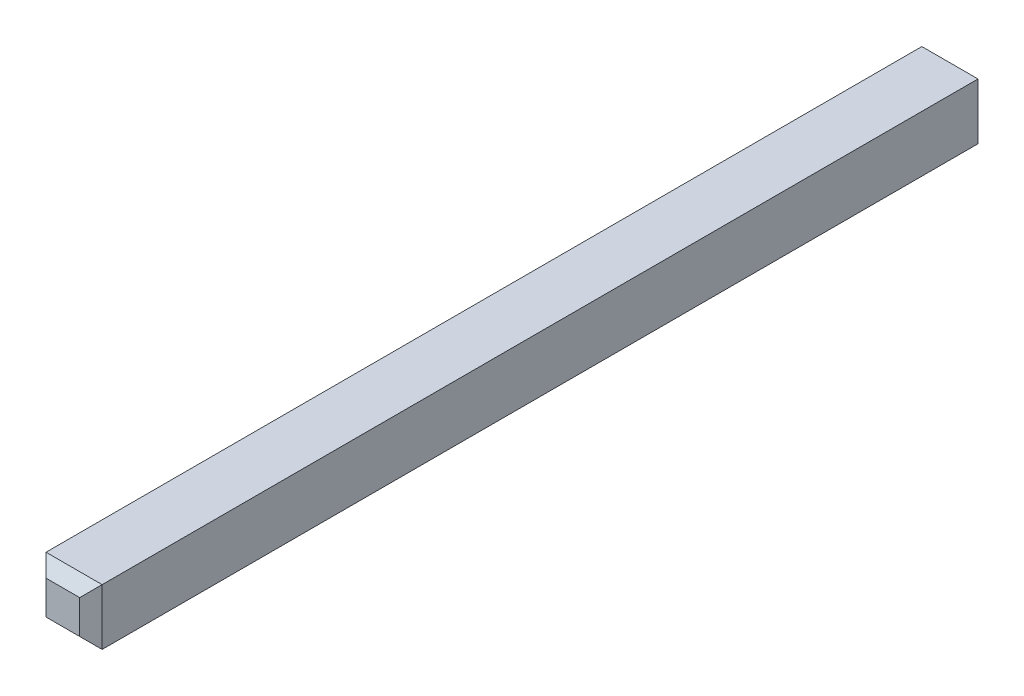
ISO-10303-21;
HEADER;
FILE_DESCRIPTION(('STEP AP214'),'2;1');
FILE_NAME('part.step','',(''),(''),'','','');
FILE_SCHEMA(('AUTOMOTIVE_DESIGN { 1 0 10303 214 1 1 1 1 }'));
ENDSEC;
DATA;
#1=APPLICATION_CONTEXT('core data for automotive mechanical design processes');
#2=APPLICATION_PROTOCOL_DEFINITION('international standard','automotive_design',2000,#1);
#3=PRODUCT_CONTEXT('',#1,'mechanical');
#4=PRODUCT('Part','Part','',(#3));
#5=PRODUCT_RELATED_PRODUCT_CATEGORY('part','',(#4));
#6=PRODUCT_DEFINITION_FORMATION('','',#4);
#7=PRODUCT_DEFINITION_CONTEXT('part definition',#1,'design');
#8=PRODUCT_DEFINITION('design','',#6,#7);
#9=PRODUCT_DEFINITION_SHAPE('','',#8);
#10=(LENGTH_UNIT() NAMED_UNIT(*) SI_UNIT(.MILLI.,.METRE.));
#11=(NAMED_UNIT(*) PLANE_ANGLE_UNIT() SI_UNIT($,.RADIAN.));
#12=(NAMED_UNIT(*) SI_UNIT($,.STERADIAN.) SOLID_ANGLE_UNIT());
#13=UNCERTAINTY_MEASURE_WITH_UNIT(LENGTH_MEASURE(1.E-05),#10,'distance_accuracy_value','');
#14=(GEOMETRIC_REPRESENTATION_CONTEXT(3) GLOBAL_UNCERTAINTY_ASSIGNED_CONTEXT((#13)) GLOBAL_UNIT_ASSIGNED_CONTEXT((#10,
#11,#12)) REPRESENTATION_CONTEXT('',''));
#15=CARTESIAN_POINT('',(0.,0.,0.));
#16=DIRECTION('',(0.,0.,1.));
#17=DIRECTION('',(1.,0.,0.));
#18=AXIS2_PLACEMENT_3D('',#15,#16,#17);
#19=CARTESIAN_POINT('',(0.25,-0.25,-3.3));
#20=DIRECTION('',(0.707106781186549,0.,-0.707106781186547));
#21=DIRECTION('',(-0.707106781186547,0.,-0.707106781186549));
#22=AXIS2_PLACEMENT_3D('',#19,#20,#21);
#23=PLANE('',#22);
#24=DIRECTION('',(0.577350269189626,-0.577350269189626,0.577350269189625));
#25=VECTOR('',#24,1.);
#26=CARTESIAN_POINT('',(0.15,-0.15,-3.4));
#27=LINE('',#26,#25);
#28=CARTESIAN_POINT('',(0.15,-0.15,-3.4));
#29=VERTEX_POINT('',#28);
#30=CARTESIAN_POINT('',(0.25,-0.25,-3.3));
#31=VERTEX_POINT('',#30);
#32=EDGE_CURVE('E77',#29,#31,#27,.T.);
#33=ORIENTED_EDGE('',*,*,#32,.F.);
#34=DIRECTION('',(0.,1.,0.));
#35=VECTOR('',#34,1.);
#36=CARTESIAN_POINT('',(0.15,-0.25,-3.4));
#37=LINE('',#36,#35);
#38=CARTESIAN_POINT('',(0.15,0.15,-3.4));
#39=VERTEX_POINT('',#38);
#40=EDGE_CURVE('E108',#29,#39,#37,.T.);
#41=ORIENTED_EDGE('',*,*,#40,.T.);
#42=DIRECTION('',(0.577350269189626,0.577350269189626,0.577350269189625));
#43=VECTOR('',#42,1.);
#44=CARTESIAN_POINT('',(0.15,0.15,-3.4));
#45=LINE('',#44,#43);
#46=CARTESIAN_POINT('',(0.25,0.25,-3.3));
#47=VERTEX_POINT('',#46);
#48=EDGE_CURVE('E116',#39,#47,#45,.T.);
#49=ORIENTED_EDGE('',*,*,#48,.T.);
#50=DIRECTION('',(0.,1.,0.));
#51=VECTOR('',#50,1.);
#52=CARTESIAN_POINT('',(0.25,-0.25,-3.3));
#53=LINE('',#52,#51);
#54=EDGE_CURVE('E119',#31,#47,#53,.T.);
#55=ORIENTED_EDGE('',*,*,#54,.F.);
#56=EDGE_LOOP('',(#33,#41,#49,#55));
#57=FACE_BOUND('',#56,.T.);
#58=ADVANCED_FACE('F16',(#57),#23,.T.);
#59=CARTESIAN_POINT('',(0.149999999999999,-0.25,4.6));
#60=DIRECTION('',(-0.707106781186549,0.,-0.707106781186547));
#61=DIRECTION('',(-0.707106781186547,0.,0.707106781186549));
#62=AXIS2_PLACEMENT_3D('',#59,#60,#61);
#63=PLANE('',#62);
#64=DIRECTION('',(0.,1.,0.));
#65=VECTOR('',#64,1.);
#66=CARTESIAN_POINT('',(0.149999999999999,-0.25,4.6));
#67=LINE('',#66,#65);
#68=CARTESIAN_POINT('',(0.149999999999999,-0.15,4.6));
#69=VERTEX_POINT('',#68);
#70=CARTESIAN_POINT('',(0.149999999999999,0.15,4.6));
#71=VERTEX_POINT('',#70);
#72=EDGE_CURVE('E19',#69,#71,#67,.T.);
#73=ORIENTED_EDGE('',*,*,#72,.F.);
#74=DIRECTION('',(0.577350269189629,-0.577350269189623,-0.577350269189625));
#75=VECTOR('',#74,1.);
#76=CARTESIAN_POINT('',(0.149999999999999,-0.15,4.6));
#77=LINE('',#76,#75);
#78=CARTESIAN_POINT('',(0.25,-0.25,4.5));
#79=VERTEX_POINT('',#78);
#80=EDGE_CURVE('E86',#69,#79,#77,.T.);
#81=ORIENTED_EDGE('',*,*,#80,.T.);
#82=DIRECTION('',(0.,1.,0.));
#83=VECTOR('',#82,1.);
#84=CARTESIAN_POINT('',(0.25,-0.25,4.5));
#85=LINE('',#84,#83);
#86=CARTESIAN_POINT('',(0.25,0.25,4.5));
#87=VERTEX_POINT('',#86);
#88=EDGE_CURVE('E121',#87,#79,#85,.F.);
#89=ORIENTED_EDGE('',*,*,#88,.F.);
#90=DIRECTION('',(0.577350269189629,0.577350269189623,-0.577350269189625));
#91=VECTOR('',#90,1.);
#92=CARTESIAN_POINT('',(0.149999999999999,0.15,4.6));
#93=LINE('',#92,#91);
#94=EDGE_CURVE('E88',#71,#87,#93,.T.);
#95=ORIENTED_EDGE('',*,*,#94,.F.);
#96=EDGE_LOOP('',(#73,#81,#89,#95));
#97=FACE_BOUND('',#96,.T.);
#98=ADVANCED_FACE('F84',(#97),#63,.F.);
#99=CARTESIAN_POINT('',(0.,-0.25,4.6));
#100=DIRECTION('',(0.,0.,1.));
#101=DIRECTION('',(1.,0.,0.));
#102=AXIS2_PLACEMENT_3D('',#99,#100,#101);
#103=PLANE('',#102);
#104=DIRECTION('',(1.,0.,0.));
#105=VECTOR('',#104,1.);
#106=CARTESIAN_POINT('',(0.,0.15,4.6));
#107=LINE('',#106,#105);
#108=CARTESIAN_POINT('',(-0.15,0.15,4.6));
#109=VERTEX_POINT('',#108);
#110=EDGE_CURVE('E111',#109,#71,#107,.T.);
#111=ORIENTED_EDGE('',*,*,#110,.F.);
#112=DIRECTION('',(0.,1.,0.));
#113=VECTOR('',#112,1.);
#114=CARTESIAN_POINT('',(-0.15,-0.25,4.6));
#115=LINE('',#114,#113);
#116=CARTESIAN_POINT('',(-0.15,-0.15,4.6));
#117=VERTEX_POINT('',#116);
#118=EDGE_CURVE('E102',#117,#109,#115,.T.);
#119=ORIENTED_EDGE('',*,*,#118,.F.);
#120=DIRECTION('',(1.,0.,0.));
#121=VECTOR('',#120,1.);
#122=CARTESIAN_POINT('',(0.,-0.15,4.6));
#123=LINE('',#122,#121);
#124=EDGE_CURVE('E92',#117,#69,#123,.T.);
#125=ORIENTED_EDGE('',*,*,#124,.T.);
#126=ORIENTED_EDGE('',*,*,#72,.T.);
#127=EDGE_LOOP('',(#111,#119,#125,#126));
#128=FACE_BOUND('',#127,.T.);
#129=ADVANCED_FACE('F100',(#128),#103,.T.);
#130=CARTESIAN_POINT('',(0.,-0.15,4.6));
#131=DIRECTION('',(0.,0.707106781186549,-0.707106781186547));
#132=DIRECTION('',(0.,0.707106781186547,0.707106781186549));
#133=AXIS2_PLACEMENT_3D('',#130,#131,#132);
#134=PLANE('',#133);
#135=DIRECTION('',(1.,0.,0.));
#136=VECTOR('',#135,1.);
#137=CARTESIAN_POINT('',(0.,-0.25,4.5));
#138=LINE('',#137,#136);
#139=CARTESIAN_POINT('',(-0.25,-0.25,4.5));
#140=VERTEX_POINT('',#139);
#141=EDGE_CURVE('E97',#79,#140,#138,.F.);
#142=ORIENTED_EDGE('',*,*,#141,.F.);
#143=ORIENTED_EDGE('',*,*,#80,.F.);
#144=ORIENTED_EDGE('',*,*,#124,.F.);
#145=DIRECTION('',(0.577350269189625,0.577350269189625,0.577350269189627));
#146=VECTOR('',#145,1.);
#147=CARTESIAN_POINT('',(-0.25,-0.25,4.5));
#148=LINE('',#147,#146);
#149=EDGE_CURVE('E125',#140,#117,#148,.T.);
#150=ORIENTED_EDGE('',*,*,#149,.F.);
#151=EDGE_LOOP('',(#142,#143,#144,#150));
#152=FACE_BOUND('',#151,.T.);
#153=ADVANCED_FACE('F94',(#152),#134,.F.);
#154=CARTESIAN_POINT('',(0.,-0.25,-3.3));
#155=DIRECTION('',(0.,-0.707106781186547,-0.707106781186548));
#156=DIRECTION('',(0.,0.707106781186548,-0.707106781186547));
#157=AXIS2_PLACEMENT_3D('',#154,#155,#156);
#158=PLANE('',#157);
#159=ORIENTED_EDGE('',*,*,#32,.T.);
#160=DIRECTION('',(1.,0.,0.));
#161=VECTOR('',#160,1.);
#162=CARTESIAN_POINT('',(0.,-0.25,-3.3));
#163=LINE('',#162,#161);
#164=CARTESIAN_POINT('',(-0.25,-0.25,-3.3));
#165=VERTEX_POINT('',#164);
#166=EDGE_CURVE('E128',#165,#31,#163,.T.);
#167=ORIENTED_EDGE('',*,*,#166,.F.);
#168=DIRECTION('',(0.577350269189625,0.577350269189625,-0.577350269189627));
#169=VECTOR('',#168,1.);
#170=CARTESIAN_POINT('',(-0.25,-0.25,-3.3));
#171=LINE('',#170,#169);
#172=CARTESIAN_POINT('',(-0.15,-0.15,-3.4));
#173=VERTEX_POINT('',#172);
#174=EDGE_CURVE('E135',#165,#173,#171,.T.);
#175=ORIENTED_EDGE('',*,*,#174,.T.);
#176=DIRECTION('',(1.,0.,0.));
#177=VECTOR('',#176,1.);
#178=CARTESIAN_POINT('',(0.,-0.15,-3.4));
#179=LINE('',#178,#177);
#180=EDGE_CURVE('E105',#173,#29,#179,.T.);
#181=ORIENTED_EDGE('',*,*,#180,.T.);
#182=EDGE_LOOP('',(#159,#167,#175,#181));
#183=FACE_BOUND('',#182,.T.);
#184=ADVANCED_FACE('F205',(#183),#158,.T.);
#185=CARTESIAN_POINT('',(0.,-0.25,-3.4));
#186=DIRECTION('',(0.,0.,1.));
#187=DIRECTION('',(1.,0.,0.));
#188=AXIS2_PLACEMENT_3D('',#185,#186,#187);
#189=PLANE('',#188);
#190=ORIENTED_EDGE('',*,*,#40,.F.);
#191=ORIENTED_EDGE('',*,*,#180,.F.);
#192=DIRECTION('',(0.,1.,0.));
#193=VECTOR('',#192,1.);
#194=CARTESIAN_POINT('',(-0.15,-0.25,-3.4));
#195=LINE('',#194,#193);
#196=CARTESIAN_POINT('',(-0.15,0.15,-3.4));
#197=VERTEX_POINT('',#196);
#198=EDGE_CURVE('E138',#173,#197,#195,.T.);
#199=ORIENTED_EDGE('',*,*,#198,.T.);
#200=DIRECTION('',(1.,0.,0.));
#201=VECTOR('',#200,1.);
#202=CARTESIAN_POINT('',(0.,0.15,-3.4));
#203=LINE('',#202,#201);
#204=EDGE_CURVE('E113',#197,#39,#203,.T.);
#205=ORIENTED_EDGE('',*,*,#204,.T.);
#206=EDGE_LOOP('',(#190,#191,#199,#205));
#207=FACE_BOUND('',#206,.T.);
#208=ADVANCED_FACE('F202',(#207),#189,.F.);
#209=CARTESIAN_POINT('',(0.,0.25,4.5));
#210=DIRECTION('',(0.,0.707106781186549,0.707106781186547));
#211=DIRECTION('',(0.,-0.707106781186547,0.707106781186549));
#212=AXIS2_PLACEMENT_3D('',#209,#210,#211);
#213=PLANE('',#212);
#214=DIRECTION('',(-0.577350269189625,0.577350269189626,-0.577350269189627));
#215=VECTOR('',#214,1.);
#216=CARTESIAN_POINT('',(-0.15,0.15,4.6));
#217=LINE('',#216,#215);
#218=CARTESIAN_POINT('',(-0.25,0.25,4.5));
#219=VERTEX_POINT('',#218);
#220=EDGE_CURVE('E123',#109,#219,#217,.T.);
#221=ORIENTED_EDGE('',*,*,#220,.F.);
#222=ORIENTED_EDGE('',*,*,#110,.T.);
#223=ORIENTED_EDGE('',*,*,#94,.T.);
#224=DIRECTION('',(1.,0.,0.));
#225=VECTOR('',#224,1.);
#226=CARTESIAN_POINT('',(0.,0.25,4.5));
#227=LINE('',#226,#225);
#228=EDGE_CURVE('E143',#87,#219,#227,.F.);
#229=ORIENTED_EDGE('',*,*,#228,.T.);
#230=EDGE_LOOP('',(#221,#222,#223,#229));
#231=FACE_BOUND('',#230,.T.);
#232=ADVANCED_FACE('F176',(#231),#213,.T.);
#233=CARTESIAN_POINT('',(0.,0.15,-3.4));
#234=DIRECTION('',(0.,-0.707106781186547,0.707106781186548));
#235=DIRECTION('',(0.,-0.707106781186548,-0.707106781186547));
#236=AXIS2_PLACEMENT_3D('',#233,#234,#235);
#237=PLANE('',#236);
#238=ORIENTED_EDGE('',*,*,#204,.F.);
#239=DIRECTION('',(-0.577350269189625,0.577350269189626,0.577350269189627));
#240=VECTOR('',#239,1.);
#241=CARTESIAN_POINT('',(-0.15,0.15,-3.4));
#242=LINE('',#241,#240);
#243=CARTESIAN_POINT('',(-0.25,0.25,-3.3));
#244=VERTEX_POINT('',#243);
#245=EDGE_CURVE('E141',#197,#244,#242,.T.);
#246=ORIENTED_EDGE('',*,*,#245,.T.);
#247=DIRECTION('',(1.,0.,0.));
#248=VECTOR('',#247,1.);
#249=CARTESIAN_POINT('',(0.,0.25,-3.3));
#250=LINE('',#249,#248);
#251=EDGE_CURVE('E33',#244,#47,#250,.T.);
#252=ORIENTED_EDGE('',*,*,#251,.T.);
#253=ORIENTED_EDGE('',*,*,#48,.F.);
#254=EDGE_LOOP('',(#238,#246,#252,#253));
#255=FACE_BOUND('',#254,.T.);
#256=ADVANCED_FACE('F195',(#255),#237,.F.);
#257=CARTESIAN_POINT('',(0.25,-0.25,3.1));
#258=DIRECTION('',(1.,0.,0.));
#259=DIRECTION('',(0.,0.,-1.));
#260=AXIS2_PLACEMENT_3D('',#257,#258,#259);
#261=PLANE('',#260);
#262=DIRECTION('',(0.,0.,-1.));
#263=VECTOR('',#262,1.);
#264=CARTESIAN_POINT('',(0.25,0.25,0.6));
#265=LINE('',#264,#263);
#266=EDGE_CURVE('E147',#47,#87,#265,.F.);
#267=ORIENTED_EDGE('',*,*,#266,.T.);
#268=ORIENTED_EDGE('',*,*,#88,.T.);
#269=DIRECTION('',(0.,0.,-1.));
#270=VECTOR('',#269,1.);
#271=CARTESIAN_POINT('',(0.25,-0.25,0.6));
#272=LINE('',#271,#270);
#273=EDGE_CURVE('E131',#31,#79,#272,.F.);
#274=ORIENTED_EDGE('',*,*,#273,.F.);
#275=ORIENTED_EDGE('',*,*,#54,.T.);
#276=EDGE_LOOP('',(#267,#268,#274,#275));
#277=FACE_BOUND('',#276,.T.);
#278=ADVANCED_FACE('F192',(#277),#261,.T.);
#279=CARTESIAN_POINT('',(-0.25,-0.25,4.5));
#280=DIRECTION('',(-0.707106781186549,0.,0.707106781186547));
#281=DIRECTION('',(0.707106781186547,0.,0.707106781186549));
#282=AXIS2_PLACEMENT_3D('',#279,#280,#281);
#283=PLANE('',#282);
#284=ORIENTED_EDGE('',*,*,#149,.T.);
#285=ORIENTED_EDGE('',*,*,#118,.T.);
#286=ORIENTED_EDGE('',*,*,#220,.T.);
#287=DIRECTION('',(0.,1.,0.));
#288=VECTOR('',#287,1.);
#289=CARTESIAN_POINT('',(-0.25,-0.25,4.5));
#290=LINE('',#289,#288);
#291=EDGE_CURVE('E150',#219,#140,#290,.F.);
#292=ORIENTED_EDGE('',*,*,#291,.T.);
#293=EDGE_LOOP('',(#284,#285,#286,#292));
#294=FACE_BOUND('',#293,.T.);
#295=ADVANCED_FACE('F172',(#294),#283,.T.);
#296=CARTESIAN_POINT('',(0.,-0.25,0.6));
#297=DIRECTION('',(0.,-1.,0.));
#298=DIRECTION('',(0.,0.,-1.));
#299=AXIS2_PLACEMENT_3D('',#296,#297,#298);
#300=PLANE('',#299);
#301=ORIENTED_EDGE('',*,*,#273,.T.);
#302=ORIENTED_EDGE('',*,*,#141,.T.);
#303=DIRECTION('',(0.,0.,-1.));
#304=VECTOR('',#303,1.);
#305=CARTESIAN_POINT('',(-0.25,-0.25,3.1));
#306=LINE('',#305,#304);
#307=EDGE_CURVE('E153',#140,#165,#306,.T.);
#308=ORIENTED_EDGE('',*,*,#307,.T.);
#309=ORIENTED_EDGE('',*,*,#166,.T.);
#310=EDGE_LOOP('',(#301,#302,#308,#309));
#311=FACE_BOUND('',#310,.T.);
#312=ADVANCED_FACE('F169',(#311),#300,.T.);
#313=CARTESIAN_POINT('',(-0.15,-0.25,-3.4));
#314=DIRECTION('',(0.707106781186549,0.,0.707106781186547));
#315=DIRECTION('',(0.707106781186547,0.,-0.707106781186549));
#316=AXIS2_PLACEMENT_3D('',#313,#314,#315);
#317=PLANE('',#316);
#318=ORIENTED_EDGE('',*,*,#198,.F.);
#319=ORIENTED_EDGE('',*,*,#174,.F.);
#320=DIRECTION('',(0.,1.,0.));
#321=VECTOR('',#320,1.);
#322=CARTESIAN_POINT('',(-0.25,-0.25,-3.3));
#323=LINE('',#322,#321);
#324=EDGE_CURVE('E25',#165,#244,#323,.T.);
#325=ORIENTED_EDGE('',*,*,#324,.T.);
#326=ORIENTED_EDGE('',*,*,#245,.F.);
#327=EDGE_LOOP('',(#318,#319,#325,#326));
#328=FACE_BOUND('',#327,.T.);
#329=ADVANCED_FACE('F161',(#328),#317,.F.);
#330=CARTESIAN_POINT('',(0.,0.25,0.6));
#331=DIRECTION('',(0.,-1.,0.));
#332=DIRECTION('',(0.,0.,-1.));
#333=AXIS2_PLACEMENT_3D('',#330,#331,#332);
#334=PLANE('',#333);
#335=ORIENTED_EDGE('',*,*,#251,.F.);
#336=DIRECTION('',(0.,0.,-1.));
#337=VECTOR('',#336,1.);
#338=CARTESIAN_POINT('',(-0.25,0.25,3.1));
#339=LINE('',#338,#337);
#340=EDGE_CURVE('E11',#244,#219,#339,.F.);
#341=ORIENTED_EDGE('',*,*,#340,.T.);
#342=ORIENTED_EDGE('',*,*,#228,.F.);
#343=ORIENTED_EDGE('',*,*,#266,.F.);
#344=EDGE_LOOP('',(#335,#341,#342,#343));
#345=FACE_BOUND('',#344,.T.);
#346=ADVANCED_FACE('F177',(#345),#334,.F.);
#347=CARTESIAN_POINT('',(-0.25,-0.25,3.1));
#348=DIRECTION('',(1.,0.,0.));
#349=DIRECTION('',(0.,0.,-1.));
#350=AXIS2_PLACEMENT_3D('',#347,#348,#349);
#351=PLANE('',#350);
#352=ORIENTED_EDGE('',*,*,#324,.F.);
#353=ORIENTED_EDGE('',*,*,#307,.F.);
#354=ORIENTED_EDGE('',*,*,#291,.F.);
#355=ORIENTED_EDGE('',*,*,#340,.F.);
#356=EDGE_LOOP('',(#352,#353,#354,#355));
#357=FACE_BOUND('',#356,.T.);
#358=ADVANCED_FACE('F166',(#357),#351,.F.);
#359=CLOSED_SHELL('',(#58,#98,#129,#153,#184,#208,#232,#256,#278,#295,#312,#329,#346,#358));
#360=MANIFOLD_SOLID_BREP('B1',#359);
#361=ADVANCED_BREP_SHAPE_REPRESENTATION('',(#18,#360),#14);
#362=SHAPE_DEFINITION_REPRESENTATION(#9,#361);
ENDSEC;
END-ISO-10303-21;
